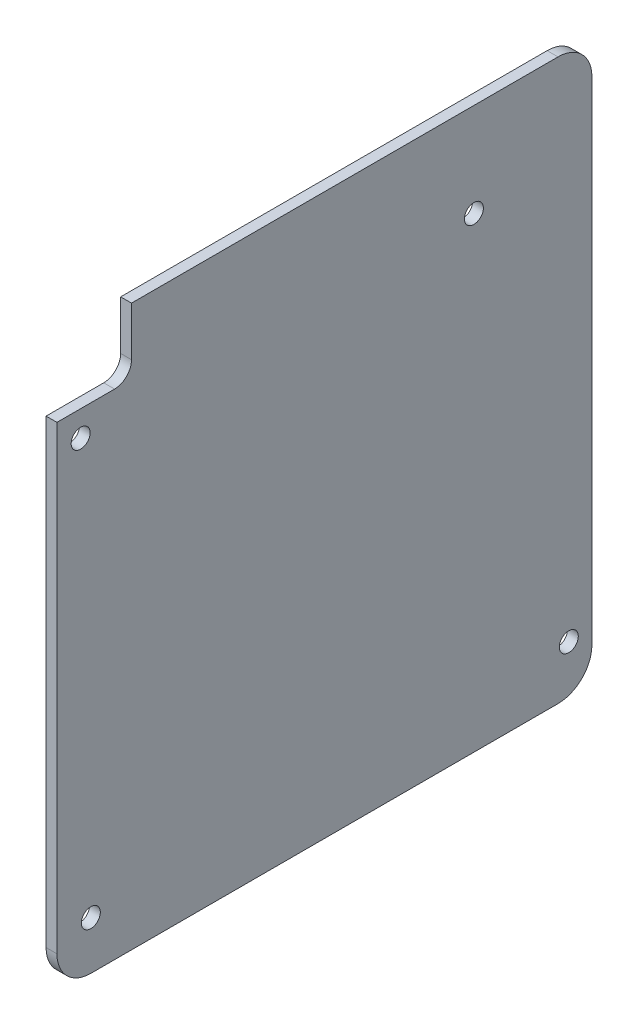
ISO-10303-21;
HEADER;
FILE_DESCRIPTION(('STEP AP214'),'2;1');
FILE_NAME('part.step','',(''),(''),'','','');
FILE_SCHEMA(('AUTOMOTIVE_DESIGN { 1 0 10303 214 1 1 1 1 }'));
ENDSEC;
DATA;
#1=APPLICATION_CONTEXT('core data for automotive mechanical design processes');
#2=APPLICATION_PROTOCOL_DEFINITION('international standard','automotive_design',2000,#1);
#3=PRODUCT_CONTEXT('',#1,'mechanical');
#4=PRODUCT('Part','Part','',(#3));
#5=PRODUCT_RELATED_PRODUCT_CATEGORY('part','',(#4));
#6=PRODUCT_DEFINITION_FORMATION('','',#4);
#7=PRODUCT_DEFINITION_CONTEXT('part definition',#1,'design');
#8=PRODUCT_DEFINITION('design','',#6,#7);
#9=PRODUCT_DEFINITION_SHAPE('','',#8);
#10=(LENGTH_UNIT() NAMED_UNIT(*) SI_UNIT(.MILLI.,.METRE.));
#11=(NAMED_UNIT(*) PLANE_ANGLE_UNIT() SI_UNIT($,.RADIAN.));
#12=(NAMED_UNIT(*) SI_UNIT($,.STERADIAN.) SOLID_ANGLE_UNIT());
#13=UNCERTAINTY_MEASURE_WITH_UNIT(LENGTH_MEASURE(1.E-05),#10,'distance_accuracy_value','');
#14=(GEOMETRIC_REPRESENTATION_CONTEXT(3) GLOBAL_UNCERTAINTY_ASSIGNED_CONTEXT((#13)) GLOBAL_UNIT_ASSIGNED_CONTEXT((#10,
#11,#12)) REPRESENTATION_CONTEXT('',''));
#15=CARTESIAN_POINT('',(0.,0.,0.));
#16=DIRECTION('',(0.,0.,1.));
#17=DIRECTION('',(1.,0.,0.));
#18=AXIS2_PLACEMENT_3D('',#15,#16,#17);
#19=CARTESIAN_POINT('',(0.8,34.0635369687705,30.9685422172991));
#20=DIRECTION('',(1.,0.,0.));
#21=DIRECTION('',(0.,0.,-1.));
#22=AXIS2_PLACEMENT_3D('',#19,#20,#21);
#23=PLANE('',#22);
#24=CARTESIAN_POINT('',(0.8,-34.2064630312295,34.4685422172992));
#25=DIRECTION('',(1.,0.,0.));
#26=DIRECTION('',(0.,0.,-1.));
#27=AXIS2_PLACEMENT_3D('',#24,#25,#26);
#28=CIRCLE('',#27,1.4);
#29=CARTESIAN_POINT('',(0.8,-34.2064630312295,33.0685422172992));
#30=VERTEX_POINT('',#29);
#31=EDGE_CURVE('E261',#30,#30,#28,.T.);
#32=ORIENTED_EDGE('',*,*,#31,.F.);
#33=EDGE_LOOP('',(#32));
#34=FACE_BOUND('',#33,.T.);
#35=CARTESIAN_POINT('',(0.8,27.7935369687705,35.9685422172992));
#36=DIRECTION('',(1.,0.,0.));
#37=DIRECTION('',(0.,0.,-1.));
#38=AXIS2_PLACEMENT_3D('',#35,#36,#37);
#39=CIRCLE('',#38,1.4);
#40=CARTESIAN_POINT('',(0.8,27.7935369687705,34.5685422172992));
#41=VERTEX_POINT('',#40);
#42=EDGE_CURVE('E162',#41,#41,#39,.T.);
#43=ORIENTED_EDGE('',*,*,#42,.F.);
#44=EDGE_LOOP('',(#43));
#45=FACE_BOUND('',#44,.T.);
#46=CARTESIAN_POINT('',(0.8,34.0635369687705,30.9685422172991));
#47=DIRECTION('',(-1.,0.,0.));
#48=DIRECTION('',(0.,0.,-1.));
#49=AXIS2_PLACEMENT_3D('',#46,#47,#48);
#50=CIRCLE('',#49,2.5);
#51=CARTESIAN_POINT('',(0.8,34.0635369687705,28.4685422172991));
#52=VERTEX_POINT('',#51);
#53=CARTESIAN_POINT('',(0.8,31.5635369687705,30.9685422172991));
#54=VERTEX_POINT('',#53);
#55=EDGE_CURVE('E186',#52,#54,#50,.T.);
#56=ORIENTED_EDGE('',*,*,#55,.T.);
#57=DIRECTION('',(0.,0.,1.));
#58=VECTOR('',#57,1.);
#59=CARTESIAN_POINT('',(0.8,31.5635369687705,39.4685422172992));
#60=LINE('',#59,#58);
#61=CARTESIAN_POINT('',(0.8,31.5635369687705,39.4685422172992));
#62=VERTEX_POINT('',#61);
#63=EDGE_CURVE('E110',#54,#62,#60,.T.);
#64=ORIENTED_EDGE('',*,*,#63,.T.);
#65=DIRECTION('',(0.,-1.,0.));
#66=VECTOR('',#65,1.);
#67=CARTESIAN_POINT('',(0.8,-36.3232831325302,39.4685422172992));
#68=LINE('',#67,#66);
#69=CARTESIAN_POINT('',(0.8,-36.3232831325302,39.4685422172992));
#70=VERTEX_POINT('',#69);
#71=EDGE_CURVE('E215',#62,#70,#68,.T.);
#72=ORIENTED_EDGE('',*,*,#71,.T.);
#73=CARTESIAN_POINT('',(0.8,-36.3232831325302,34.4685422172992));
#74=DIRECTION('',(1.,0.,0.));
#75=DIRECTION('',(0.,0.,1.));
#76=AXIS2_PLACEMENT_3D('',#73,#74,#75);
#77=CIRCLE('',#76,4.99999999999999);
#78=CARTESIAN_POINT('',(0.8,-41.3232831325301,34.4685422172992));
#79=VERTEX_POINT('',#78);
#80=EDGE_CURVE('E235',#70,#79,#77,.T.);
#81=ORIENTED_EDGE('',*,*,#80,.T.);
#82=DIRECTION('',(0.,0.,-1.));
#83=VECTOR('',#82,1.);
#84=CARTESIAN_POINT('',(0.8,-41.3232831325302,34.4685422172992));
#85=LINE('',#84,#83);
#86=CARTESIAN_POINT('',(0.8,-41.3232831325302,-34.4401311707619));
#87=VERTEX_POINT('',#86);
#88=EDGE_CURVE('E231',#79,#87,#85,.T.);
#89=ORIENTED_EDGE('',*,*,#88,.T.);
#90=CARTESIAN_POINT('',(0.8,-36.3232831325302,-34.4401311707619));
#91=DIRECTION('',(1.,0.,0.));
#92=DIRECTION('',(0.,0.,-1.));
#93=AXIS2_PLACEMENT_3D('',#90,#91,#92);
#94=CIRCLE('',#93,5.);
#95=CARTESIAN_POINT('',(0.8,-36.3232831325302,-39.4401311707619));
#96=VERTEX_POINT('',#95);
#97=EDGE_CURVE('E234',#87,#96,#94,.T.);
#98=ORIENTED_EDGE('',*,*,#97,.T.);
#99=DIRECTION('',(0.,1.,0.));
#100=VECTOR('',#99,1.);
#101=CARTESIAN_POINT('',(0.8,-36.3232831325302,-39.4401311707619));
#102=LINE('',#101,#100);
#103=CARTESIAN_POINT('',(0.8,36.2935369687705,-39.4401311707619));
#104=VERTEX_POINT('',#103);
#105=EDGE_CURVE('E135',#96,#104,#102,.T.);
#106=ORIENTED_EDGE('',*,*,#105,.T.);
#107=CARTESIAN_POINT('',(0.8,36.2935369687705,-34.4401311707619));
#108=DIRECTION('',(1.,0.,0.));
#109=DIRECTION('',(0.,0.,1.));
#110=AXIS2_PLACEMENT_3D('',#107,#108,#109);
#111=CIRCLE('',#110,5.);
#112=CARTESIAN_POINT('',(0.8,41.2935369687705,-34.4401311707619));
#113=VERTEX_POINT('',#112);
#114=EDGE_CURVE('E129',#104,#113,#111,.T.);
#115=ORIENTED_EDGE('',*,*,#114,.T.);
#116=DIRECTION('',(0.,0.,1.));
#117=VECTOR('',#116,1.);
#118=CARTESIAN_POINT('',(0.8,41.2935369687705,28.4685422172991));
#119=LINE('',#118,#117);
#120=CARTESIAN_POINT('',(0.8,41.2935369687705,28.4685422172991));
#121=VERTEX_POINT('',#120);
#122=EDGE_CURVE('E133',#113,#121,#119,.T.);
#123=ORIENTED_EDGE('',*,*,#122,.T.);
#124=DIRECTION('',(0.,-1.,0.));
#125=VECTOR('',#124,1.);
#126=CARTESIAN_POINT('',(0.8,41.2935369687705,28.4685422172991));
#127=LINE('',#126,#125);
#128=EDGE_CURVE('E61',#121,#52,#127,.T.);
#129=ORIENTED_EDGE('',*,*,#128,.T.);
#130=EDGE_LOOP('',(#56,#64,#72,#81,#89,#98,#106,#115,#123,#129));
#131=FACE_BOUND('',#130,.T.);
#132=CARTESIAN_POINT('',(0.8,27.4935369687705,-22.0314577827008));
#133=DIRECTION('',(1.,0.,0.));
#134=DIRECTION('',(0.,0.,-1.));
#135=AXIS2_PLACEMENT_3D('',#132,#133,#134);
#136=CIRCLE('',#135,1.4);
#137=CARTESIAN_POINT('',(0.8,27.4935369687705,-23.4314577827008));
#138=VERTEX_POINT('',#137);
#139=EDGE_CURVE('E253',#138,#138,#136,.T.);
#140=ORIENTED_EDGE('',*,*,#139,.F.);
#141=EDGE_LOOP('',(#140));
#142=FACE_BOUND('',#141,.T.);
#143=CARTESIAN_POINT('',(0.8,-34.2064630312295,-36.0314577827009));
#144=DIRECTION('',(1.,0.,0.));
#145=DIRECTION('',(0.,0.,-1.));
#146=AXIS2_PLACEMENT_3D('',#143,#144,#145);
#147=CIRCLE('',#146,1.4);
#148=CARTESIAN_POINT('',(0.8,-34.2064630312295,-37.4314577827009));
#149=VERTEX_POINT('',#148);
#150=EDGE_CURVE('E269',#149,#149,#147,.T.);
#151=ORIENTED_EDGE('',*,*,#150,.F.);
#152=EDGE_LOOP('',(#151));
#153=FACE_BOUND('',#152,.T.);
#154=ADVANCED_FACE('F43',(#34,#45,#131,#142,#153),#23,.T.);
#155=CARTESIAN_POINT('',(-0.8,34.0635369687705,30.9685422172991));
#156=DIRECTION('',(1.,0.,0.));
#157=DIRECTION('',(0.,0.,-1.));
#158=AXIS2_PLACEMENT_3D('',#155,#156,#157);
#159=PLANE('',#158);
#160=CARTESIAN_POINT('',(-0.8,34.0635369687705,30.9685422172991));
#161=DIRECTION('',(-1.,0.,0.));
#162=DIRECTION('',(0.,0.,-1.));
#163=AXIS2_PLACEMENT_3D('',#160,#161,#162);
#164=CIRCLE('',#163,2.5);
#165=CARTESIAN_POINT('',(-0.8,34.0635369687705,28.4685422172991));
#166=VERTEX_POINT('',#165);
#167=CARTESIAN_POINT('',(-0.8,31.5635369687705,30.9685422172991));
#168=VERTEX_POINT('',#167);
#169=EDGE_CURVE('E157',#166,#168,#164,.T.);
#170=ORIENTED_EDGE('',*,*,#169,.F.);
#171=DIRECTION('',(0.,-1.,0.));
#172=VECTOR('',#171,1.);
#173=CARTESIAN_POINT('',(-0.8,41.2935369687705,28.4685422172991));
#174=LINE('',#173,#172);
#175=CARTESIAN_POINT('',(-0.8,41.2935369687705,28.4685422172991));
#176=VERTEX_POINT('',#175);
#177=EDGE_CURVE('E102',#176,#166,#174,.T.);
#178=ORIENTED_EDGE('',*,*,#177,.F.);
#179=DIRECTION('',(0.,0.,1.));
#180=VECTOR('',#179,1.);
#181=CARTESIAN_POINT('',(-0.8,41.2935369687705,28.4685422172991));
#182=LINE('',#181,#180);
#183=CARTESIAN_POINT('',(-0.8,41.2935369687705,-34.4401311707619));
#184=VERTEX_POINT('',#183);
#185=EDGE_CURVE('E96',#184,#176,#182,.T.);
#186=ORIENTED_EDGE('',*,*,#185,.F.);
#187=CARTESIAN_POINT('',(-0.8,36.2935369687705,-34.4401311707619));
#188=DIRECTION('',(1.,0.,0.));
#189=DIRECTION('',(0.,0.,1.));
#190=AXIS2_PLACEMENT_3D('',#187,#188,#189);
#191=CIRCLE('',#190,5.);
#192=CARTESIAN_POINT('',(-0.8,36.2935369687705,-39.4401311707619));
#193=VERTEX_POINT('',#192);
#194=EDGE_CURVE('E144',#193,#184,#191,.T.);
#195=ORIENTED_EDGE('',*,*,#194,.F.);
#196=DIRECTION('',(0.,1.,0.));
#197=VECTOR('',#196,1.);
#198=CARTESIAN_POINT('',(-0.8,-36.3232831325302,-39.4401311707619));
#199=LINE('',#198,#197);
#200=CARTESIAN_POINT('',(-0.8,-36.3232831325302,-39.4401311707619));
#201=VERTEX_POINT('',#200);
#202=EDGE_CURVE('E177',#201,#193,#199,.T.);
#203=ORIENTED_EDGE('',*,*,#202,.F.);
#204=CARTESIAN_POINT('',(-0.8,-36.3232831325302,-34.4401311707619));
#205=DIRECTION('',(1.,0.,0.));
#206=DIRECTION('',(0.,0.,-1.));
#207=AXIS2_PLACEMENT_3D('',#204,#205,#206);
#208=CIRCLE('',#207,5.);
#209=CARTESIAN_POINT('',(-0.8,-41.3232831325302,-34.4401311707619));
#210=VERTEX_POINT('',#209);
#211=EDGE_CURVE('E174',#210,#201,#208,.T.);
#212=ORIENTED_EDGE('',*,*,#211,.F.);
#213=DIRECTION('',(0.,0.,-1.));
#214=VECTOR('',#213,1.);
#215=CARTESIAN_POINT('',(-0.8,-41.3232831325302,34.4685422172992));
#216=LINE('',#215,#214);
#217=CARTESIAN_POINT('',(-0.8,-41.3232831325301,34.4685422172992));
#218=VERTEX_POINT('',#217);
#219=EDGE_CURVE('E171',#218,#210,#216,.T.);
#220=ORIENTED_EDGE('',*,*,#219,.F.);
#221=CARTESIAN_POINT('',(-0.8,-36.3232831325302,34.4685422172992));
#222=DIRECTION('',(1.,0.,0.));
#223=DIRECTION('',(0.,0.,1.));
#224=AXIS2_PLACEMENT_3D('',#221,#222,#223);
#225=CIRCLE('',#224,4.99999999999999);
#226=CARTESIAN_POINT('',(-0.8,-36.3232831325302,39.4685422172992));
#227=VERTEX_POINT('',#226);
#228=EDGE_CURVE('E168',#227,#218,#225,.T.);
#229=ORIENTED_EDGE('',*,*,#228,.F.);
#230=DIRECTION('',(0.,-1.,0.));
#231=VECTOR('',#230,1.);
#232=CARTESIAN_POINT('',(-0.8,-36.3232831325302,39.4685422172992));
#233=LINE('',#232,#231);
#234=CARTESIAN_POINT('',(-0.8,31.5635369687705,39.4685422172992));
#235=VERTEX_POINT('',#234);
#236=EDGE_CURVE('E165',#235,#227,#233,.T.);
#237=ORIENTED_EDGE('',*,*,#236,.F.);
#238=DIRECTION('',(0.,0.,1.));
#239=VECTOR('',#238,1.);
#240=CARTESIAN_POINT('',(-0.8,31.5635369687705,39.4685422172992));
#241=LINE('',#240,#239);
#242=EDGE_CURVE('E161',#168,#235,#241,.T.);
#243=ORIENTED_EDGE('',*,*,#242,.F.);
#244=EDGE_LOOP('',(#170,#178,#186,#195,#203,#212,#220,#229,#237,#243));
#245=FACE_BOUND('',#244,.T.);
#246=CARTESIAN_POINT('',(-0.8,27.7935369687705,35.9685422172992));
#247=DIRECTION('',(1.,0.,0.));
#248=DIRECTION('',(0.,0.,-1.));
#249=AXIS2_PLACEMENT_3D('',#246,#247,#248);
#250=CIRCLE('',#249,1.4);
#251=CARTESIAN_POINT('',(-0.8,27.7935369687705,34.5685422172992));
#252=VERTEX_POINT('',#251);
#253=EDGE_CURVE('E249',#252,#252,#250,.T.);
#254=ORIENTED_EDGE('',*,*,#253,.T.);
#255=EDGE_LOOP('',(#254));
#256=FACE_BOUND('',#255,.T.);
#257=CARTESIAN_POINT('',(-0.8,27.4935369687705,-22.0314577827008));
#258=DIRECTION('',(1.,0.,0.));
#259=DIRECTION('',(0.,0.,-1.));
#260=AXIS2_PLACEMENT_3D('',#257,#258,#259);
#261=CIRCLE('',#260,1.4);
#262=CARTESIAN_POINT('',(-0.8,27.4935369687705,-23.4314577827008));
#263=VERTEX_POINT('',#262);
#264=EDGE_CURVE('E257',#263,#263,#261,.T.);
#265=ORIENTED_EDGE('',*,*,#264,.T.);
#266=EDGE_LOOP('',(#265));
#267=FACE_BOUND('',#266,.T.);
#268=CARTESIAN_POINT('',(-0.8,-34.2064630312295,34.4685422172992));
#269=DIRECTION('',(1.,0.,0.));
#270=DIRECTION('',(0.,0.,-1.));
#271=AXIS2_PLACEMENT_3D('',#268,#269,#270);
#272=CIRCLE('',#271,1.4);
#273=CARTESIAN_POINT('',(-0.8,-34.2064630312295,33.0685422172992));
#274=VERTEX_POINT('',#273);
#275=EDGE_CURVE('E265',#274,#274,#272,.T.);
#276=ORIENTED_EDGE('',*,*,#275,.T.);
#277=EDGE_LOOP('',(#276));
#278=FACE_BOUND('',#277,.T.);
#279=CARTESIAN_POINT('',(-0.8,-34.2064630312295,-36.0314577827009));
#280=DIRECTION('',(1.,0.,0.));
#281=DIRECTION('',(0.,0.,-1.));
#282=AXIS2_PLACEMENT_3D('',#279,#280,#281);
#283=CIRCLE('',#282,1.4);
#284=CARTESIAN_POINT('',(-0.8,-34.2064630312295,-37.4314577827009));
#285=VERTEX_POINT('',#284);
#286=EDGE_CURVE('E273',#285,#285,#283,.T.);
#287=ORIENTED_EDGE('',*,*,#286,.T.);
#288=EDGE_LOOP('',(#287));
#289=FACE_BOUND('',#288,.T.);
#290=ADVANCED_FACE('F219',(#245,#256,#267,#278,#289),#159,.F.);
#291=CARTESIAN_POINT('',(0.8,34.0635369687705,30.9685422172991));
#292=DIRECTION('',(-1.,0.,0.));
#293=DIRECTION('',(0.,0.,1.));
#294=AXIS2_PLACEMENT_3D('',#291,#292,#293);
#295=CYLINDRICAL_SURFACE('',#294,2.5);
#296=ORIENTED_EDGE('',*,*,#169,.T.);
#297=DIRECTION('',(-1.,0.,0.));
#298=VECTOR('',#297,1.);
#299=CARTESIAN_POINT('',(0.8,31.5635369687705,30.9685422172991));
#300=LINE('',#299,#298);
#301=EDGE_CURVE('E11',#54,#168,#300,.T.);
#302=ORIENTED_EDGE('',*,*,#301,.F.);
#303=ORIENTED_EDGE('',*,*,#55,.F.);
#304=DIRECTION('',(-1.,0.,0.));
#305=VECTOR('',#304,1.);
#306=CARTESIAN_POINT('',(0.8,34.0635369687705,28.4685422172991));
#307=LINE('',#306,#305);
#308=EDGE_CURVE('E153',#52,#166,#307,.T.);
#309=ORIENTED_EDGE('',*,*,#308,.T.);
#310=EDGE_LOOP('',(#296,#302,#303,#309));
#311=FACE_BOUND('',#310,.T.);
#312=ADVANCED_FACE('F45',(#311),#295,.F.);
#313=CARTESIAN_POINT('',(0.8,31.5635369687705,39.4685422172992));
#314=DIRECTION('',(0.,-1.,0.));
#315=DIRECTION('',(0.,0.,-1.));
#316=AXIS2_PLACEMENT_3D('',#313,#314,#315);
#317=PLANE('',#316);
#318=ORIENTED_EDGE('',*,*,#242,.T.);
#319=DIRECTION('',(-1.,0.,0.));
#320=VECTOR('',#319,1.);
#321=CARTESIAN_POINT('',(0.8,31.5635369687705,39.4685422172992));
#322=LINE('',#321,#320);
#323=EDGE_CURVE('E53',#62,#235,#322,.T.);
#324=ORIENTED_EDGE('',*,*,#323,.F.);
#325=ORIENTED_EDGE('',*,*,#63,.F.);
#326=ORIENTED_EDGE('',*,*,#301,.T.);
#327=EDGE_LOOP('',(#318,#324,#325,#326));
#328=FACE_BOUND('',#327,.T.);
#329=ADVANCED_FACE('F317',(#328),#317,.F.);
#330=CARTESIAN_POINT('',(0.8,-36.3232831325302,39.4685422172992));
#331=DIRECTION('',(0.,0.,-1.));
#332=DIRECTION('',(-1.,0.,0.));
#333=AXIS2_PLACEMENT_3D('',#330,#331,#332);
#334=PLANE('',#333);
#335=ORIENTED_EDGE('',*,*,#236,.T.);
#336=DIRECTION('',(-1.,0.,0.));
#337=VECTOR('',#336,1.);
#338=CARTESIAN_POINT('',(0.8,-36.3232831325302,39.4685422172992));
#339=LINE('',#338,#337);
#340=EDGE_CURVE('E205',#70,#227,#339,.T.);
#341=ORIENTED_EDGE('',*,*,#340,.F.);
#342=ORIENTED_EDGE('',*,*,#71,.F.);
#343=ORIENTED_EDGE('',*,*,#323,.T.);
#344=EDGE_LOOP('',(#335,#341,#342,#343));
#345=FACE_BOUND('',#344,.T.);
#346=ADVANCED_FACE('F213',(#345),#334,.F.);
#347=CARTESIAN_POINT('',(0.8,-36.3232831325302,34.4685422172992));
#348=DIRECTION('',(-1.,0.,0.));
#349=DIRECTION('',(0.,0.,1.));
#350=AXIS2_PLACEMENT_3D('',#347,#348,#349);
#351=CYLINDRICAL_SURFACE('',#350,4.99999999999999);
#352=ORIENTED_EDGE('',*,*,#228,.T.);
#353=DIRECTION('',(-1.,0.,0.));
#354=VECTOR('',#353,1.);
#355=CARTESIAN_POINT('',(0.8,-41.3232831325301,34.4685422172992));
#356=LINE('',#355,#354);
#357=EDGE_CURVE('E201',#79,#218,#356,.T.);
#358=ORIENTED_EDGE('',*,*,#357,.F.);
#359=ORIENTED_EDGE('',*,*,#80,.F.);
#360=ORIENTED_EDGE('',*,*,#340,.T.);
#361=EDGE_LOOP('',(#352,#358,#359,#360));
#362=FACE_BOUND('',#361,.T.);
#363=ADVANCED_FACE('F225',(#362),#351,.T.);
#364=CARTESIAN_POINT('',(0.8,-41.3232831325302,34.4685422172992));
#365=DIRECTION('',(0.,1.,0.));
#366=DIRECTION('',(0.,0.,1.));
#367=AXIS2_PLACEMENT_3D('',#364,#365,#366);
#368=PLANE('',#367);
#369=ORIENTED_EDGE('',*,*,#219,.T.);
#370=DIRECTION('',(-1.,0.,0.));
#371=VECTOR('',#370,1.);
#372=CARTESIAN_POINT('',(0.8,-41.3232831325302,-34.4401311707619));
#373=LINE('',#372,#371);
#374=EDGE_CURVE('E197',#87,#210,#373,.T.);
#375=ORIENTED_EDGE('',*,*,#374,.F.);
#376=ORIENTED_EDGE('',*,*,#88,.F.);
#377=ORIENTED_EDGE('',*,*,#357,.T.);
#378=EDGE_LOOP('',(#369,#375,#376,#377));
#379=FACE_BOUND('',#378,.T.);
#380=ADVANCED_FACE('F229',(#379),#368,.F.);
#381=CARTESIAN_POINT('',(0.8,-36.3232831325302,-34.4401311707619));
#382=DIRECTION('',(-1.,0.,0.));
#383=DIRECTION('',(0.,0.,1.));
#384=AXIS2_PLACEMENT_3D('',#381,#382,#383);
#385=CYLINDRICAL_SURFACE('',#384,5.);
#386=ORIENTED_EDGE('',*,*,#211,.T.);
#387=DIRECTION('',(-1.,0.,0.));
#388=VECTOR('',#387,1.);
#389=CARTESIAN_POINT('',(0.8,-36.3232831325302,-39.4401311707619));
#390=LINE('',#389,#388);
#391=EDGE_CURVE('E193',#96,#201,#390,.T.);
#392=ORIENTED_EDGE('',*,*,#391,.F.);
#393=ORIENTED_EDGE('',*,*,#97,.F.);
#394=ORIENTED_EDGE('',*,*,#374,.T.);
#395=EDGE_LOOP('',(#386,#392,#393,#394));
#396=FACE_BOUND('',#395,.T.);
#397=ADVANCED_FACE('F307',(#396),#385,.T.);
#398=CARTESIAN_POINT('',(0.8,-36.3232831325302,-39.4401311707619));
#399=DIRECTION('',(0.,0.,1.));
#400=DIRECTION('',(1.,0.,0.));
#401=AXIS2_PLACEMENT_3D('',#398,#399,#400);
#402=PLANE('',#401);
#403=ORIENTED_EDGE('',*,*,#202,.T.);
#404=DIRECTION('',(-1.,0.,0.));
#405=VECTOR('',#404,1.);
#406=CARTESIAN_POINT('',(0.8,36.2935369687705,-39.4401311707619));
#407=LINE('',#406,#405);
#408=EDGE_CURVE('E146',#104,#193,#407,.T.);
#409=ORIENTED_EDGE('',*,*,#408,.F.);
#410=ORIENTED_EDGE('',*,*,#105,.F.);
#411=ORIENTED_EDGE('',*,*,#391,.T.);
#412=EDGE_LOOP('',(#403,#409,#410,#411));
#413=FACE_BOUND('',#412,.T.);
#414=ADVANCED_FACE('F304',(#413),#402,.F.);
#415=CARTESIAN_POINT('',(0.8,36.2935369687705,-34.4401311707619));
#416=DIRECTION('',(-1.,0.,0.));
#417=DIRECTION('',(0.,0.,1.));
#418=AXIS2_PLACEMENT_3D('',#415,#416,#417);
#419=CYLINDRICAL_SURFACE('',#418,5.);
#420=ORIENTED_EDGE('',*,*,#194,.T.);
#421=DIRECTION('',(-1.,0.,0.));
#422=VECTOR('',#421,1.);
#423=CARTESIAN_POINT('',(0.8,41.2935369687705,-34.4401311707619));
#424=LINE('',#423,#422);
#425=EDGE_CURVE('E141',#113,#184,#424,.T.);
#426=ORIENTED_EDGE('',*,*,#425,.F.);
#427=ORIENTED_EDGE('',*,*,#114,.F.);
#428=ORIENTED_EDGE('',*,*,#408,.T.);
#429=EDGE_LOOP('',(#420,#426,#427,#428));
#430=FACE_BOUND('',#429,.T.);
#431=ADVANCED_FACE('F142',(#430),#419,.T.);
#432=CARTESIAN_POINT('',(0.8,41.2935369687705,28.4685422172991));
#433=DIRECTION('',(0.,-1.,0.));
#434=DIRECTION('',(0.,0.,-1.));
#435=AXIS2_PLACEMENT_3D('',#432,#433,#434);
#436=PLANE('',#435);
#437=ORIENTED_EDGE('',*,*,#185,.T.);
#438=DIRECTION('',(-1.,0.,0.));
#439=VECTOR('',#438,1.);
#440=CARTESIAN_POINT('',(0.8,41.2935369687705,28.4685422172991));
#441=LINE('',#440,#439);
#442=EDGE_CURVE('E147',#121,#176,#441,.T.);
#443=ORIENTED_EDGE('',*,*,#442,.F.);
#444=ORIENTED_EDGE('',*,*,#122,.F.);
#445=ORIENTED_EDGE('',*,*,#425,.T.);
#446=EDGE_LOOP('',(#437,#443,#444,#445));
#447=FACE_BOUND('',#446,.T.);
#448=ADVANCED_FACE('F149',(#447),#436,.F.);
#449=CARTESIAN_POINT('',(0.8,41.2935369687705,28.4685422172991));
#450=DIRECTION('',(0.,0.,-1.));
#451=DIRECTION('',(-1.,0.,0.));
#452=AXIS2_PLACEMENT_3D('',#449,#450,#451);
#453=PLANE('',#452);
#454=ORIENTED_EDGE('',*,*,#177,.T.);
#455=ORIENTED_EDGE('',*,*,#308,.F.);
#456=ORIENTED_EDGE('',*,*,#128,.F.);
#457=ORIENTED_EDGE('',*,*,#442,.T.);
#458=EDGE_LOOP('',(#454,#455,#456,#457));
#459=FACE_BOUND('',#458,.T.);
#460=ADVANCED_FACE('F297',(#459),#453,.F.);
#461=CARTESIAN_POINT('',(0.8,27.7935369687705,35.9685422172992));
#462=DIRECTION('',(-1.,0.,0.));
#463=DIRECTION('',(0.,0.,1.));
#464=AXIS2_PLACEMENT_3D('',#461,#462,#463);
#465=CYLINDRICAL_SURFACE('',#464,1.4);
#466=ORIENTED_EDGE('',*,*,#42,.T.);
#467=EDGE_LOOP('',(#466));
#468=FACE_BOUND('',#467,.T.);
#469=ORIENTED_EDGE('',*,*,#253,.F.);
#470=EDGE_LOOP('',(#469));
#471=FACE_BOUND('',#470,.T.);
#472=ADVANCED_FACE('F294',(#468,#471),#465,.F.);
#473=CARTESIAN_POINT('',(0.8,27.4935369687705,-22.0314577827008));
#474=DIRECTION('',(-1.,0.,0.));
#475=DIRECTION('',(0.,0.,1.));
#476=AXIS2_PLACEMENT_3D('',#473,#474,#475);
#477=CYLINDRICAL_SURFACE('',#476,1.4);
#478=ORIENTED_EDGE('',*,*,#139,.T.);
#479=EDGE_LOOP('',(#478));
#480=FACE_BOUND('',#479,.T.);
#481=ORIENTED_EDGE('',*,*,#264,.F.);
#482=EDGE_LOOP('',(#481));
#483=FACE_BOUND('',#482,.T.);
#484=ADVANCED_FACE('F407',(#480,#483),#477,.F.);
#485=CARTESIAN_POINT('',(0.8,-34.2064630312295,34.4685422172992));
#486=DIRECTION('',(-1.,0.,0.));
#487=DIRECTION('',(0.,0.,1.));
#488=AXIS2_PLACEMENT_3D('',#485,#486,#487);
#489=CYLINDRICAL_SURFACE('',#488,1.4);
#490=ORIENTED_EDGE('',*,*,#31,.T.);
#491=EDGE_LOOP('',(#490));
#492=FACE_BOUND('',#491,.T.);
#493=ORIENTED_EDGE('',*,*,#275,.F.);
#494=EDGE_LOOP('',(#493));
#495=FACE_BOUND('',#494,.T.);
#496=ADVANCED_FACE('F416',(#492,#495),#489,.F.);
#497=CARTESIAN_POINT('',(0.8,-34.2064630312295,-36.0314577827009));
#498=DIRECTION('',(-1.,0.,0.));
#499=DIRECTION('',(0.,0.,1.));
#500=AXIS2_PLACEMENT_3D('',#497,#498,#499);
#501=CYLINDRICAL_SURFACE('',#500,1.4);
#502=ORIENTED_EDGE('',*,*,#150,.T.);
#503=EDGE_LOOP('',(#502));
#504=FACE_BOUND('',#503,.T.);
#505=ORIENTED_EDGE('',*,*,#286,.F.);
#506=EDGE_LOOP('',(#505));
#507=FACE_BOUND('',#506,.T.);
#508=ADVANCED_FACE('F281',(#504,#507),#501,.F.);
#509=CLOSED_SHELL('',(#154,#290,#312,#329,#346,#363,#380,#397,#414,#431,#448,#460,#472,#484,
#496,#508));
#510=MANIFOLD_SOLID_BREP('B2',#509);
#511=ADVANCED_BREP_SHAPE_REPRESENTATION('',(#18,#510),#14);
#512=SHAPE_DEFINITION_REPRESENTATION(#9,#511);
ENDSEC;
END-ISO-10303-21;
